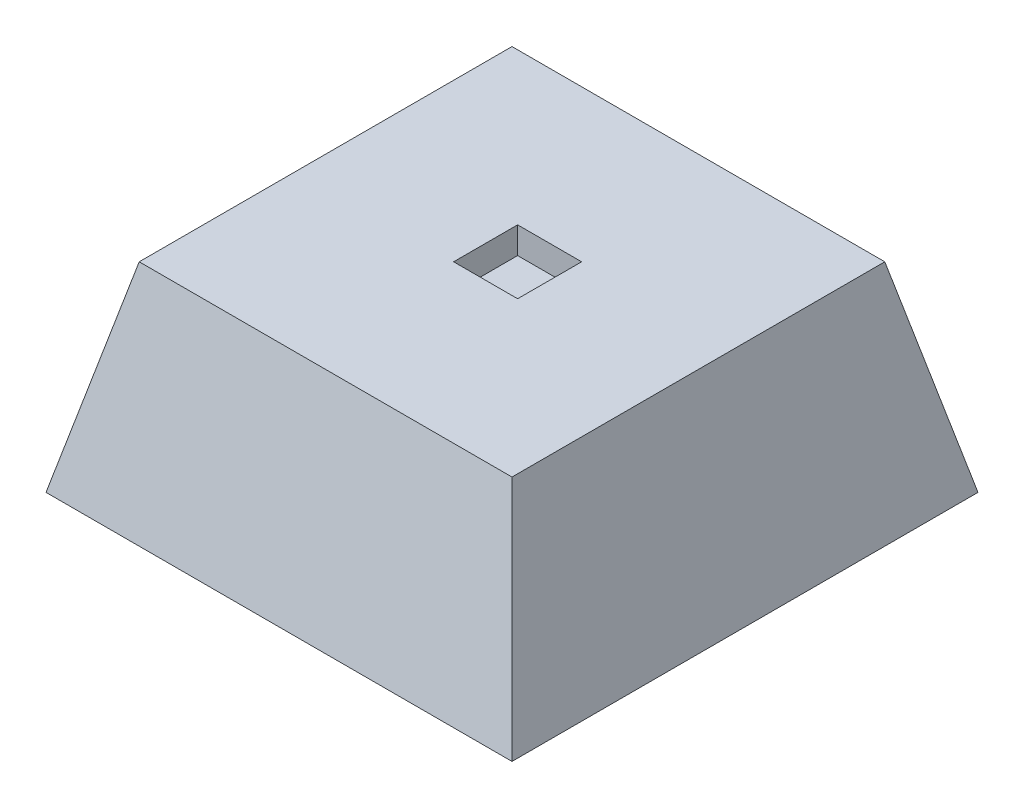
ISO-10303-21;
HEADER;
FILE_DESCRIPTION(('STEP AP214'),'2;1');
FILE_NAME('part.step','',(''),(''),'','','');
FILE_SCHEMA(('AUTOMOTIVE_DESIGN { 1 0 10303 214 1 1 1 1 }'));
ENDSEC;
DATA;
#1=APPLICATION_CONTEXT('core data for automotive mechanical design processes');
#2=APPLICATION_PROTOCOL_DEFINITION('international standard','automotive_design',2000,#1);
#3=PRODUCT_CONTEXT('',#1,'mechanical');
#4=PRODUCT('Part','Part','',(#3));
#5=PRODUCT_RELATED_PRODUCT_CATEGORY('part','',(#4));
#6=PRODUCT_DEFINITION_FORMATION('','',#4);
#7=PRODUCT_DEFINITION_CONTEXT('part definition',#1,'design');
#8=PRODUCT_DEFINITION('design','',#6,#7);
#9=PRODUCT_DEFINITION_SHAPE('','',#8);
#10=(LENGTH_UNIT() NAMED_UNIT(*) SI_UNIT(.MILLI.,.METRE.));
#11=(NAMED_UNIT(*) PLANE_ANGLE_UNIT() SI_UNIT($,.RADIAN.));
#12=(NAMED_UNIT(*) SI_UNIT($,.STERADIAN.) SOLID_ANGLE_UNIT());
#13=UNCERTAINTY_MEASURE_WITH_UNIT(LENGTH_MEASURE(1.E-05),#10,'distance_accuracy_value','');
#14=(GEOMETRIC_REPRESENTATION_CONTEXT(3) GLOBAL_UNCERTAINTY_ASSIGNED_CONTEXT((#13)) GLOBAL_UNIT_ASSIGNED_CONTEXT((#10,
#11,#12)) REPRESENTATION_CONTEXT('',''));
#15=CARTESIAN_POINT('',(0.,0.,0.));
#16=DIRECTION('',(0.,0.,1.));
#17=DIRECTION('',(1.,0.,0.));
#18=AXIS2_PLACEMENT_3D('',#15,#16,#17);
#19=CARTESIAN_POINT('',(0.,3.,0.));
#20=DIRECTION('',(0.,-1.,0.));
#21=DIRECTION('',(0.,0.,-1.));
#22=AXIS2_PLACEMENT_3D('',#19,#20,#21);
#23=PLANE('',#22);
#24=DIRECTION('',(-1.,0.,0.));
#25=VECTOR('',#24,1.);
#26=CARTESIAN_POINT('',(11.,3.,-0.7));
#27=LINE('',#26,#25);
#28=CARTESIAN_POINT('',(6.3,3.,-0.7));
#29=VERTEX_POINT('',#28);
#30=CARTESIAN_POINT('',(0.7,3.,-0.7));
#31=VERTEX_POINT('',#30);
#32=EDGE_CURVE('E65',#29,#31,#27,.T.);
#33=ORIENTED_EDGE('',*,*,#32,.F.);
#34=DIRECTION('',(0.,0.,1.));
#35=VECTOR('',#34,1.);
#36=CARTESIAN_POINT('',(6.3,3.,-7.));
#37=LINE('',#36,#35);
#38=CARTESIAN_POINT('',(6.3,3.,-6.3));
#39=VERTEX_POINT('',#38);
#40=EDGE_CURVE('E157',#39,#29,#37,.T.);
#41=ORIENTED_EDGE('',*,*,#40,.F.);
#42=DIRECTION('',(-1.,0.,0.));
#43=VECTOR('',#42,1.);
#44=CARTESIAN_POINT('',(11.,3.,-6.3));
#45=LINE('',#44,#43);
#46=CARTESIAN_POINT('',(0.699999999999998,3.,-6.3));
#47=VERTEX_POINT('',#46);
#48=EDGE_CURVE('E144',#39,#47,#45,.T.);
#49=ORIENTED_EDGE('',*,*,#48,.T.);
#50=DIRECTION('',(0.,0.,1.));
#51=VECTOR('',#50,1.);
#52=CARTESIAN_POINT('',(0.7,3.,-7.));
#53=LINE('',#52,#51);
#54=EDGE_CURVE('E158',#47,#31,#53,.T.);
#55=ORIENTED_EDGE('',*,*,#54,.T.);
#56=EDGE_LOOP('',(#33,#41,#49,#55));
#57=FACE_BOUND('',#56,.T.);
#58=DIRECTION('',(-1.,0.,0.));
#59=VECTOR('',#58,1.);
#60=CARTESIAN_POINT('',(4.02303653858318,3.,-3.061447104075));
#61=LINE('',#60,#59);
#62=CARTESIAN_POINT('',(4.02303653858318,3.,-3.061447104075));
#63=VERTEX_POINT('',#62);
#64=CARTESIAN_POINT('',(3.06149807704472,3.,-3.061447104075));
#65=VERTEX_POINT('',#64);
#66=EDGE_CURVE('E58',#63,#65,#61,.T.);
#67=ORIENTED_EDGE('',*,*,#66,.T.);
#68=DIRECTION('',(0.,0.,-1.));
#69=VECTOR('',#68,1.);
#70=CARTESIAN_POINT('',(3.06149807704472,3.,-3.061447104075));
#71=LINE('',#70,#69);
#72=CARTESIAN_POINT('',(3.06149807704472,3.,-4.02298556561346));
#73=VERTEX_POINT('',#72);
#74=EDGE_CURVE('E128',#65,#73,#71,.T.);
#75=ORIENTED_EDGE('',*,*,#74,.T.);
#76=DIRECTION('',(1.,0.,0.));
#77=VECTOR('',#76,1.);
#78=CARTESIAN_POINT('',(3.06149807704472,3.,-4.02298556561346));
#79=LINE('',#78,#77);
#80=CARTESIAN_POINT('',(4.02303653858318,3.,-4.02298556561346));
#81=VERTEX_POINT('',#80);
#82=EDGE_CURVE('E341',#73,#81,#79,.T.);
#83=ORIENTED_EDGE('',*,*,#82,.T.);
#84=DIRECTION('',(0.,0.,1.));
#85=VECTOR('',#84,1.);
#86=CARTESIAN_POINT('',(4.02303653858318,3.,-4.02298556561346));
#87=LINE('',#86,#85);
#88=EDGE_CURVE('E124',#81,#63,#87,.T.);
#89=ORIENTED_EDGE('',*,*,#88,.T.);
#90=EDGE_LOOP('',(#67,#75,#83,#89));
#91=FACE_BOUND('',#90,.T.);
#92=ADVANCED_FACE('F42',(#57,#91),#23,.F.);
#93=CARTESIAN_POINT('',(7.,0.,-7.));
#94=DIRECTION('',(-0.973841209741793,-0.227229615606418,0.));
#95=DIRECTION('',(0.227229615606418,-0.973841209741793,0.));
#96=AXIS2_PLACEMENT_3D('',#93,#94,#95);
#97=PLANE('',#96);
#98=DIRECTION('',(-0.221581128241521,0.949633406749377,-0.221581128241521));
#99=VECTOR('',#98,1.);
#100=CARTESIAN_POINT('',(6.6563126252505,1.47294589178357,-0.343687374749499));
#101=LINE('',#100,#99);
#102=CARTESIAN_POINT('',(7.,0.,0.));
#103=VERTEX_POINT('',#102);
#104=EDGE_CURVE('E154',#103,#29,#101,.T.);
#105=ORIENTED_EDGE('',*,*,#104,.F.);
#106=DIRECTION('',(0.,0.,-1.));
#107=VECTOR('',#106,1.);
#108=CARTESIAN_POINT('',(7.,0.,0.));
#109=LINE('',#108,#107);
#110=CARTESIAN_POINT('',(7.,0.,-7.));
#111=VERTEX_POINT('',#110);
#112=EDGE_CURVE('E172',#103,#111,#109,.T.);
#113=ORIENTED_EDGE('',*,*,#112,.T.);
#114=DIRECTION('',(0.221581128241521,-0.949633406749377,-0.221581128241521));
#115=VECTOR('',#114,1.);
#116=CARTESIAN_POINT('',(7.,0.,-7.));
#117=LINE('',#116,#115);
#118=EDGE_CURVE('E148',#39,#111,#117,.T.);
#119=ORIENTED_EDGE('',*,*,#118,.F.);
#120=ORIENTED_EDGE('',*,*,#40,.T.);
#121=EDGE_LOOP('',(#105,#113,#119,#120));
#122=FACE_BOUND('',#121,.T.);
#123=ADVANCED_FACE('F197',(#122),#97,.F.);
#124=CARTESIAN_POINT('',(0.,0.,-7.));
#125=DIRECTION('',(0.973841209741793,-0.227229615606418,0.));
#126=DIRECTION('',(0.227229615606418,0.973841209741793,0.));
#127=AXIS2_PLACEMENT_3D('',#124,#125,#126);
#128=PLANE('',#127);
#129=DIRECTION('',(-0.221581128241521,-0.949633406749378,0.221581128241521));
#130=VECTOR('',#129,1.);
#131=CARTESIAN_POINT('',(0.343687374749499,1.47294589178357,-0.3436873747495));
#132=LINE('',#131,#130);
#133=CARTESIAN_POINT('',(0.,0.,0.));
#134=VERTEX_POINT('',#133);
#135=EDGE_CURVE('E11',#31,#134,#132,.T.);
#136=ORIENTED_EDGE('',*,*,#135,.F.);
#137=ORIENTED_EDGE('',*,*,#54,.F.);
#138=DIRECTION('',(0.221581128241521,0.949633406749377,0.221581128241521));
#139=VECTOR('',#138,1.);
#140=CARTESIAN_POINT('',(0.,0.,-7.));
#141=LINE('',#140,#139);
#142=CARTESIAN_POINT('',(0.,0.,-7.));
#143=VERTEX_POINT('',#142);
#144=EDGE_CURVE('E51',#143,#47,#141,.T.);
#145=ORIENTED_EDGE('',*,*,#144,.F.);
#146=DIRECTION('',(0.,0.,1.));
#147=VECTOR('',#146,1.);
#148=CARTESIAN_POINT('',(0.,0.,0.));
#149=LINE('',#148,#147);
#150=EDGE_CURVE('E162',#143,#134,#149,.T.);
#151=ORIENTED_EDGE('',*,*,#150,.T.);
#152=EDGE_LOOP('',(#136,#137,#145,#151));
#153=FACE_BOUND('',#152,.T.);
#154=ADVANCED_FACE('F190',(#153),#128,.F.);
#155=CARTESIAN_POINT('',(0.,0.,0.));
#156=DIRECTION('',(0.,-1.,0.));
#157=DIRECTION('',(0.,0.,-1.));
#158=AXIS2_PLACEMENT_3D('',#155,#156,#157);
#159=PLANE('',#158);
#160=CARTESIAN_POINT('',(3.5,0.,-3.5));
#161=DIRECTION('',(0.,-1.,0.));
#162=DIRECTION('',(0.,0.,-1.));
#163=AXIS2_PLACEMENT_3D('',#160,#161,#162);
#164=CIRCLE('',#163,1.8);
#165=CARTESIAN_POINT('',(3.5,0.,-5.3));
#166=VERTEX_POINT('',#165);
#167=EDGE_CURVE('E130',#166,#166,#164,.T.);
#168=ORIENTED_EDGE('',*,*,#167,.F.);
#169=EDGE_LOOP('',(#168));
#170=FACE_BOUND('',#169,.T.);
#171=ORIENTED_EDGE('',*,*,#150,.F.);
#172=DIRECTION('',(-1.,0.,0.));
#173=VECTOR('',#172,1.);
#174=CARTESIAN_POINT('',(0.,0.,-7.));
#175=LINE('',#174,#173);
#176=EDGE_CURVE('E176',#111,#143,#175,.T.);
#177=ORIENTED_EDGE('',*,*,#176,.F.);
#178=ORIENTED_EDGE('',*,*,#112,.F.);
#179=DIRECTION('',(1.,0.,0.));
#180=VECTOR('',#179,1.);
#181=CARTESIAN_POINT('',(0.,0.,0.));
#182=LINE('',#181,#180);
#183=EDGE_CURVE('E169',#134,#103,#182,.T.);
#184=ORIENTED_EDGE('',*,*,#183,.F.);
#185=EDGE_LOOP('',(#171,#177,#178,#184));
#186=FACE_BOUND('',#185,.T.);
#187=ADVANCED_FACE('F44',(#170,#186),#159,.T.);
#188=CARTESIAN_POINT('',(11.,3.,-6.3));
#189=DIRECTION('',(0.,0.227229615606418,-0.973841209741793));
#190=DIRECTION('',(0.,0.973841209741793,0.227229615606418));
#191=AXIS2_PLACEMENT_3D('',#188,#189,#190);
#192=PLANE('',#191);
#193=ORIENTED_EDGE('',*,*,#118,.T.);
#194=ORIENTED_EDGE('',*,*,#176,.T.);
#195=ORIENTED_EDGE('',*,*,#144,.T.);
#196=ORIENTED_EDGE('',*,*,#48,.F.);
#197=EDGE_LOOP('',(#193,#194,#195,#196));
#198=FACE_BOUND('',#197,.T.);
#199=ADVANCED_FACE('F181',(#198),#192,.T.);
#200=CARTESIAN_POINT('',(11.,0.,0.));
#201=DIRECTION('',(0.,0.227229615606418,0.973841209741793));
#202=DIRECTION('',(0.,-0.973841209741793,0.227229615606418));
#203=AXIS2_PLACEMENT_3D('',#200,#201,#202);
#204=PLANE('',#203);
#205=ORIENTED_EDGE('',*,*,#104,.T.);
#206=ORIENTED_EDGE('',*,*,#32,.T.);
#207=ORIENTED_EDGE('',*,*,#135,.T.);
#208=ORIENTED_EDGE('',*,*,#183,.T.);
#209=EDGE_LOOP('',(#205,#206,#207,#208));
#210=FACE_BOUND('',#209,.T.);
#211=ADVANCED_FACE('F192',(#210),#204,.T.);
#212=CARTESIAN_POINT('',(3.5,0.8,-3.5));
#213=DIRECTION('',(0.,-1.,0.));
#214=DIRECTION('',(0.,0.,-1.));
#215=AXIS2_PLACEMENT_3D('',#212,#213,#214);
#216=CYLINDRICAL_SURFACE('',#215,1.8);
#217=CARTESIAN_POINT('',(3.5,0.8,-3.5));
#218=DIRECTION('',(0.,-1.,0.));
#219=DIRECTION('',(0.,0.,-1.));
#220=AXIS2_PLACEMENT_3D('',#217,#218,#219);
#221=CIRCLE('',#220,1.8);
#222=CARTESIAN_POINT('',(3.5,0.8,-5.3));
#223=VERTEX_POINT('',#222);
#224=EDGE_CURVE('E136',#223,#223,#221,.T.);
#225=ORIENTED_EDGE('',*,*,#224,.F.);
#226=EDGE_LOOP('',(#225));
#227=FACE_BOUND('',#226,.T.);
#228=ORIENTED_EDGE('',*,*,#167,.T.);
#229=EDGE_LOOP('',(#228));
#230=FACE_BOUND('',#229,.T.);
#231=ADVANCED_FACE('F217',(#227,#230),#216,.F.);
#232=CARTESIAN_POINT('',(3.5,0.8,-3.5));
#233=DIRECTION('',(0.,-1.,0.));
#234=DIRECTION('',(0.,0.,-1.));
#235=AXIS2_PLACEMENT_3D('',#232,#233,#234);
#236=PLANE('',#235);
#237=ORIENTED_EDGE('',*,*,#224,.T.);
#238=EDGE_LOOP('',(#237));
#239=FACE_BOUND('',#238,.T.);
#240=ADVANCED_FACE('F220',(#239),#236,.T.);
#241=CARTESIAN_POINT('',(4.02303653858318,2.6,-3.061447104075));
#242=DIRECTION('',(0.,0.,-1.));
#243=DIRECTION('',(-1.,0.,0.));
#244=AXIS2_PLACEMENT_3D('',#241,#242,#243);
#245=PLANE('',#244);
#246=ORIENTED_EDGE('',*,*,#66,.F.);
#247=DIRECTION('',(0.,1.,0.));
#248=VECTOR('',#247,1.);
#249=CARTESIAN_POINT('',(4.02303653858318,2.6,-3.061447104075));
#250=LINE('',#249,#248);
#251=CARTESIAN_POINT('',(4.02303653858318,2.6,-3.061447104075));
#252=VERTEX_POINT('',#251);
#253=EDGE_CURVE('E122',#252,#63,#250,.T.);
#254=ORIENTED_EDGE('',*,*,#253,.F.);
#255=DIRECTION('',(-1.,0.,0.));
#256=VECTOR('',#255,1.);
#257=CARTESIAN_POINT('',(4.02303653858318,2.6,-3.061447104075));
#258=LINE('',#257,#256);
#259=CARTESIAN_POINT('',(3.06149807704472,2.6,-3.061447104075));
#260=VERTEX_POINT('',#259);
#261=EDGE_CURVE('E113',#252,#260,#258,.T.);
#262=ORIENTED_EDGE('',*,*,#261,.T.);
#263=DIRECTION('',(0.,1.,0.));
#264=VECTOR('',#263,1.);
#265=CARTESIAN_POINT('',(3.06149807704472,2.6,-3.061447104075));
#266=LINE('',#265,#264);
#267=EDGE_CURVE('E121',#260,#65,#266,.T.);
#268=ORIENTED_EDGE('',*,*,#267,.T.);
#269=EDGE_LOOP('',(#246,#254,#262,#268));
#270=FACE_BOUND('',#269,.T.);
#271=ADVANCED_FACE('F120',(#270),#245,.T.);
#272=CARTESIAN_POINT('',(3.06149807704472,2.6,-3.061447104075));
#273=DIRECTION('',(1.,0.,0.));
#274=DIRECTION('',(0.,0.,-1.));
#275=AXIS2_PLACEMENT_3D('',#272,#273,#274);
#276=PLANE('',#275);
#277=ORIENTED_EDGE('',*,*,#74,.F.);
#278=ORIENTED_EDGE('',*,*,#267,.F.);
#279=DIRECTION('',(0.,0.,-1.));
#280=VECTOR('',#279,1.);
#281=CARTESIAN_POINT('',(3.06149807704472,2.6,-3.061447104075));
#282=LINE('',#281,#280);
#283=CARTESIAN_POINT('',(3.06149807704472,2.6,-4.02298556561346));
#284=VERTEX_POINT('',#283);
#285=EDGE_CURVE('E109',#260,#284,#282,.T.);
#286=ORIENTED_EDGE('',*,*,#285,.T.);
#287=DIRECTION('',(0.,1.,0.));
#288=VECTOR('',#287,1.);
#289=CARTESIAN_POINT('',(3.06149807704472,2.6,-4.02298556561346));
#290=LINE('',#289,#288);
#291=EDGE_CURVE('E131',#284,#73,#290,.T.);
#292=ORIENTED_EDGE('',*,*,#291,.T.);
#293=EDGE_LOOP('',(#277,#278,#286,#292));
#294=FACE_BOUND('',#293,.T.);
#295=ADVANCED_FACE('F126',(#294),#276,.T.);
#296=CARTESIAN_POINT('',(3.06149807704472,2.6,-4.02298556561346));
#297=DIRECTION('',(0.,0.,1.));
#298=DIRECTION('',(1.,0.,0.));
#299=AXIS2_PLACEMENT_3D('',#296,#297,#298);
#300=PLANE('',#299);
#301=ORIENTED_EDGE('',*,*,#82,.F.);
#302=ORIENTED_EDGE('',*,*,#291,.F.);
#303=DIRECTION('',(1.,0.,0.));
#304=VECTOR('',#303,1.);
#305=CARTESIAN_POINT('',(3.06149807704472,2.6,-4.02298556561346));
#306=LINE('',#305,#304);
#307=CARTESIAN_POINT('',(4.02303653858318,2.6,-4.02298556561346));
#308=VERTEX_POINT('',#307);
#309=EDGE_CURVE('E114',#284,#308,#306,.T.);
#310=ORIENTED_EDGE('',*,*,#309,.T.);
#311=DIRECTION('',(0.,1.,0.));
#312=VECTOR('',#311,1.);
#313=CARTESIAN_POINT('',(4.02303653858318,2.6,-4.02298556561346));
#314=LINE('',#313,#312);
#315=EDGE_CURVE('E138',#308,#81,#314,.T.);
#316=ORIENTED_EDGE('',*,*,#315,.T.);
#317=EDGE_LOOP('',(#301,#302,#310,#316));
#318=FACE_BOUND('',#317,.T.);
#319=ADVANCED_FACE('F229',(#318),#300,.T.);
#320=CARTESIAN_POINT('',(4.02303653858318,2.6,-4.02298556561346));
#321=DIRECTION('',(-1.,0.,0.));
#322=DIRECTION('',(0.,0.,1.));
#323=AXIS2_PLACEMENT_3D('',#320,#321,#322);
#324=PLANE('',#323);
#325=ORIENTED_EDGE('',*,*,#88,.F.);
#326=ORIENTED_EDGE('',*,*,#315,.F.);
#327=DIRECTION('',(0.,0.,1.));
#328=VECTOR('',#327,1.);
#329=CARTESIAN_POINT('',(4.02303653858318,2.6,-4.02298556561346));
#330=LINE('',#329,#328);
#331=EDGE_CURVE('E351',#308,#252,#330,.T.);
#332=ORIENTED_EDGE('',*,*,#331,.T.);
#333=ORIENTED_EDGE('',*,*,#253,.T.);
#334=EDGE_LOOP('',(#325,#326,#332,#333));
#335=FACE_BOUND('',#334,.T.);
#336=ADVANCED_FACE('F232',(#335),#324,.T.);
#337=CARTESIAN_POINT('',(0.,2.6,0.));
#338=DIRECTION('',(0.,-1.,0.));
#339=DIRECTION('',(0.,0.,-1.));
#340=AXIS2_PLACEMENT_3D('',#337,#338,#339);
#341=PLANE('',#340);
#342=ORIENTED_EDGE('',*,*,#261,.F.);
#343=ORIENTED_EDGE('',*,*,#331,.F.);
#344=ORIENTED_EDGE('',*,*,#309,.F.);
#345=ORIENTED_EDGE('',*,*,#285,.F.);
#346=EDGE_LOOP('',(#342,#343,#344,#345));
#347=FACE_BOUND('',#346,.T.);
#348=ADVANCED_FACE('F111',(#347),#341,.F.);
#349=CLOSED_SHELL('',(#92,#123,#154,#187,#199,#211,#231,#240,#271,#295,#319,#336,#348));
#350=MANIFOLD_SOLID_BREP('B2',#349);
#351=ADVANCED_BREP_SHAPE_REPRESENTATION('',(#18,#350),#14);
#352=SHAPE_DEFINITION_REPRESENTATION(#9,#351);
ENDSEC;
END-ISO-10303-21;
